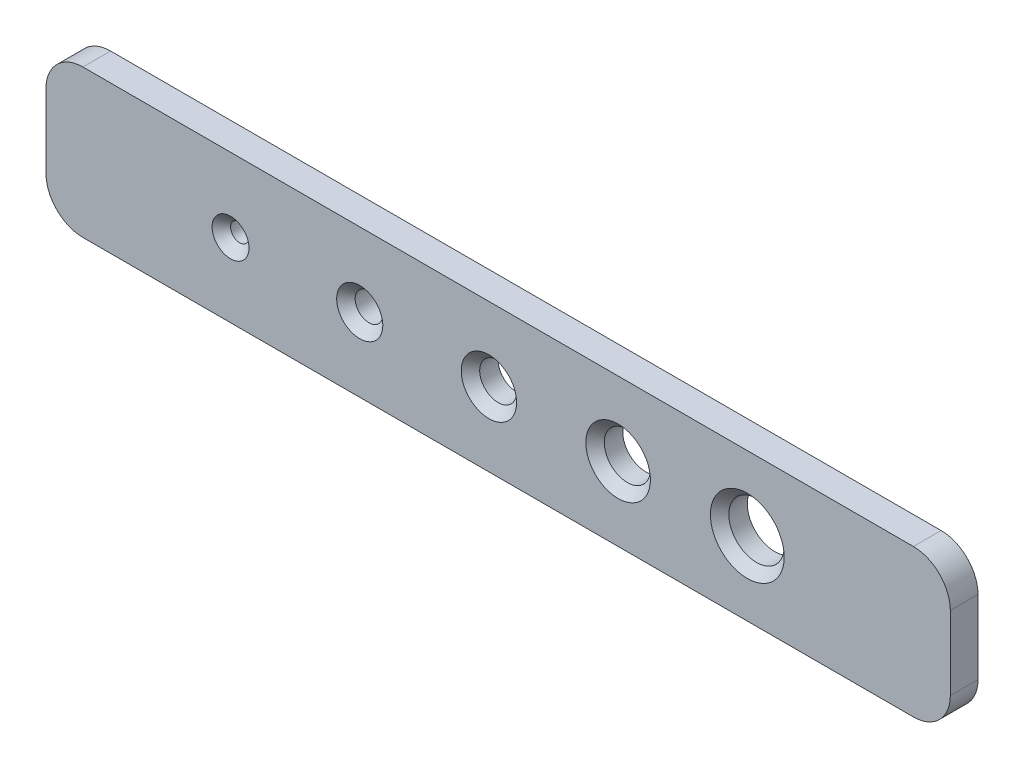
ISO-10303-21;
HEADER;
FILE_DESCRIPTION(('STEP AP214'),'2;1');
FILE_NAME('part.step','',(''),(''),'','','');
FILE_SCHEMA(('AUTOMOTIVE_DESIGN { 1 0 10303 214 1 1 1 1 }'));
ENDSEC;
DATA;
#1=APPLICATION_CONTEXT('core data for automotive mechanical design processes');
#2=APPLICATION_PROTOCOL_DEFINITION('international standard','automotive_design',2000,#1);
#3=PRODUCT_CONTEXT('',#1,'mechanical');
#4=PRODUCT('Part','Part','',(#3));
#5=PRODUCT_RELATED_PRODUCT_CATEGORY('part','',(#4));
#6=PRODUCT_DEFINITION_FORMATION('','',#4);
#7=PRODUCT_DEFINITION_CONTEXT('part definition',#1,'design');
#8=PRODUCT_DEFINITION('design','',#6,#7);
#9=PRODUCT_DEFINITION_SHAPE('','',#8);
#10=(LENGTH_UNIT() NAMED_UNIT(*) SI_UNIT(.MILLI.,.METRE.));
#11=(NAMED_UNIT(*) PLANE_ANGLE_UNIT() SI_UNIT($,.RADIAN.));
#12=(NAMED_UNIT(*) SI_UNIT($,.STERADIAN.) SOLID_ANGLE_UNIT());
#13=UNCERTAINTY_MEASURE_WITH_UNIT(LENGTH_MEASURE(1.E-05),#10,'distance_accuracy_value','');
#14=(GEOMETRIC_REPRESENTATION_CONTEXT(3) GLOBAL_UNCERTAINTY_ASSIGNED_CONTEXT((#13)) GLOBAL_UNIT_ASSIGNED_CONTEXT((#10,
#11,#12)) REPRESENTATION_CONTEXT('',''));
#15=CARTESIAN_POINT('',(0.,0.,0.));
#16=DIRECTION('',(0.,0.,1.));
#17=DIRECTION('',(1.,0.,0.));
#18=AXIS2_PLACEMENT_3D('',#15,#16,#17);
#19=CARTESIAN_POINT('',(0.,0.,4.7625));
#20=DIRECTION('',(1.,0.,0.));
#21=DIRECTION('',(0.,0.,-1.));
#22=AXIS2_PLACEMENT_3D('',#19,#20,#21);
#23=PLANE('',#22);
#24=DIRECTION('',(0.,-1.,0.));
#25=VECTOR('',#24,1.);
#26=CARTESIAN_POINT('',(0.,0.,4.7625));
#27=LINE('',#26,#25);
#28=CARTESIAN_POINT('',(0.,19.05,4.7625));
#29=VERTEX_POINT('',#28);
#30=CARTESIAN_POINT('',(0.,6.35,4.7625));
#31=VERTEX_POINT('',#30);
#32=EDGE_CURVE('E126',#29,#31,#27,.T.);
#33=ORIENTED_EDGE('',*,*,#32,.F.);
#34=DIRECTION('',(0.,0.,-1.));
#35=VECTOR('',#34,1.);
#36=CARTESIAN_POINT('',(0.,19.05,4.7625));
#37=LINE('',#36,#35);
#38=CARTESIAN_POINT('',(0.,19.05,0.));
#39=VERTEX_POINT('',#38);
#40=EDGE_CURVE('E110',#29,#39,#37,.T.);
#41=ORIENTED_EDGE('',*,*,#40,.T.);
#42=DIRECTION('',(0.,-1.,0.));
#43=VECTOR('',#42,1.);
#44=CARTESIAN_POINT('',(0.,0.,0.));
#45=LINE('',#44,#43);
#46=CARTESIAN_POINT('',(0.,6.35,0.));
#47=VERTEX_POINT('',#46);
#48=EDGE_CURVE('E123',#39,#47,#45,.T.);
#49=ORIENTED_EDGE('',*,*,#48,.T.);
#50=DIRECTION('',(0.,0.,-1.));
#51=VECTOR('',#50,1.);
#52=CARTESIAN_POINT('',(0.,6.35,4.7625));
#53=LINE('',#52,#51);
#54=EDGE_CURVE('E129',#47,#31,#53,.F.);
#55=ORIENTED_EDGE('',*,*,#54,.T.);
#56=EDGE_LOOP('',(#33,#41,#49,#55));
#57=FACE_BOUND('',#56,.T.);
#58=ADVANCED_FACE('F39',(#57),#23,.F.);
#59=CARTESIAN_POINT('',(0.,0.,4.7625));
#60=DIRECTION('',(0.,1.,0.));
#61=DIRECTION('',(0.,0.,1.));
#62=AXIS2_PLACEMENT_3D('',#59,#60,#61);
#63=PLANE('',#62);
#64=DIRECTION('',(1.,0.,0.));
#65=VECTOR('',#64,1.);
#66=CARTESIAN_POINT('',(0.,0.,4.7625));
#67=LINE('',#66,#65);
#68=CARTESIAN_POINT('',(6.35,0.,4.7625));
#69=VERTEX_POINT('',#68);
#70=CARTESIAN_POINT('',(149.225,0.,4.7625));
#71=VERTEX_POINT('',#70);
#72=EDGE_CURVE('E191',#69,#71,#67,.T.);
#73=ORIENTED_EDGE('',*,*,#72,.F.);
#74=DIRECTION('',(0.,0.,-1.));
#75=VECTOR('',#74,1.);
#76=CARTESIAN_POINT('',(6.35,0.,4.7625));
#77=LINE('',#76,#75);
#78=CARTESIAN_POINT('',(6.35,0.,0.));
#79=VERTEX_POINT('',#78);
#80=EDGE_CURVE('E182',#69,#79,#77,.T.);
#81=ORIENTED_EDGE('',*,*,#80,.T.);
#82=DIRECTION('',(1.,0.,0.));
#83=VECTOR('',#82,1.);
#84=CARTESIAN_POINT('',(0.,0.,0.));
#85=LINE('',#84,#83);
#86=CARTESIAN_POINT('',(149.225,0.,0.));
#87=VERTEX_POINT('',#86);
#88=EDGE_CURVE('E134',#79,#87,#85,.T.);
#89=ORIENTED_EDGE('',*,*,#88,.T.);
#90=DIRECTION('',(0.,0.,-1.));
#91=VECTOR('',#90,1.);
#92=CARTESIAN_POINT('',(149.225,0.,4.7625));
#93=LINE('',#92,#91);
#94=EDGE_CURVE('E179',#87,#71,#93,.F.);
#95=ORIENTED_EDGE('',*,*,#94,.T.);
#96=EDGE_LOOP('',(#73,#81,#89,#95));
#97=FACE_BOUND('',#96,.T.);
#98=ADVANCED_FACE('F280',(#97),#63,.F.);
#99=CARTESIAN_POINT('',(155.575,0.,4.7625));
#100=DIRECTION('',(-1.,0.,0.));
#101=DIRECTION('',(0.,0.,1.));
#102=AXIS2_PLACEMENT_3D('',#99,#100,#101);
#103=PLANE('',#102);
#104=DIRECTION('',(0.,1.,0.));
#105=VECTOR('',#104,1.);
#106=CARTESIAN_POINT('',(155.575,0.,4.7625));
#107=LINE('',#106,#105);
#108=CARTESIAN_POINT('',(155.575,6.35,4.7625));
#109=VERTEX_POINT('',#108);
#110=CARTESIAN_POINT('',(155.575,19.05,4.7625));
#111=VERTEX_POINT('',#110);
#112=EDGE_CURVE('E189',#109,#111,#107,.T.);
#113=ORIENTED_EDGE('',*,*,#112,.F.);
#114=DIRECTION('',(0.,0.,-1.));
#115=VECTOR('',#114,1.);
#116=CARTESIAN_POINT('',(155.575,6.35,4.7625));
#117=LINE('',#116,#115);
#118=CARTESIAN_POINT('',(155.575,6.35,0.));
#119=VERTEX_POINT('',#118);
#120=EDGE_CURVE('E11',#109,#119,#117,.T.);
#121=ORIENTED_EDGE('',*,*,#120,.T.);
#122=DIRECTION('',(0.,1.,0.));
#123=VECTOR('',#122,1.);
#124=CARTESIAN_POINT('',(155.575,0.,0.));
#125=LINE('',#124,#123);
#126=CARTESIAN_POINT('',(155.575,19.05,0.));
#127=VERTEX_POINT('',#126);
#128=EDGE_CURVE('E140',#119,#127,#125,.T.);
#129=ORIENTED_EDGE('',*,*,#128,.T.);
#130=DIRECTION('',(0.,0.,-1.));
#131=VECTOR('',#130,1.);
#132=CARTESIAN_POINT('',(155.575,19.05,4.7625));
#133=LINE('',#132,#131);
#134=EDGE_CURVE('E48',#127,#111,#133,.F.);
#135=ORIENTED_EDGE('',*,*,#134,.T.);
#136=EDGE_LOOP('',(#113,#121,#129,#135));
#137=FACE_BOUND('',#136,.T.);
#138=ADVANCED_FACE('F273',(#137),#103,.F.);
#139=CARTESIAN_POINT('',(0.,25.4,4.7625));
#140=DIRECTION('',(0.,-1.,0.));
#141=DIRECTION('',(0.,0.,-1.));
#142=AXIS2_PLACEMENT_3D('',#139,#140,#141);
#143=PLANE('',#142);
#144=DIRECTION('',(-1.,0.,0.));
#145=VECTOR('',#144,1.);
#146=CARTESIAN_POINT('',(0.,25.4,0.));
#147=LINE('',#146,#145);
#148=CARTESIAN_POINT('',(149.225,25.4,0.));
#149=VERTEX_POINT('',#148);
#150=CARTESIAN_POINT('',(6.35,25.4,0.));
#151=VERTEX_POINT('',#150);
#152=EDGE_CURVE('E151',#149,#151,#147,.T.);
#153=ORIENTED_EDGE('',*,*,#152,.T.);
#154=DIRECTION('',(0.,0.,-1.));
#155=VECTOR('',#154,1.);
#156=CARTESIAN_POINT('',(6.35,25.4,4.7625));
#157=LINE('',#156,#155);
#158=CARTESIAN_POINT('',(6.35,25.4,4.7625));
#159=VERTEX_POINT('',#158);
#160=EDGE_CURVE('E111',#151,#159,#157,.F.);
#161=ORIENTED_EDGE('',*,*,#160,.T.);
#162=DIRECTION('',(-1.,0.,0.));
#163=VECTOR('',#162,1.);
#164=CARTESIAN_POINT('',(0.,25.4,4.7625));
#165=LINE('',#164,#163);
#166=CARTESIAN_POINT('',(149.225,25.4,4.7625));
#167=VERTEX_POINT('',#166);
#168=EDGE_CURVE('E146',#167,#159,#165,.T.);
#169=ORIENTED_EDGE('',*,*,#168,.F.);
#170=DIRECTION('',(0.,0.,-1.));
#171=VECTOR('',#170,1.);
#172=CARTESIAN_POINT('',(149.225,25.4,4.7625));
#173=LINE('',#172,#171);
#174=EDGE_CURVE('E117',#167,#149,#173,.T.);
#175=ORIENTED_EDGE('',*,*,#174,.T.);
#176=EDGE_LOOP('',(#153,#161,#169,#175));
#177=FACE_BOUND('',#176,.T.);
#178=ADVANCED_FACE('F258',(#177),#143,.F.);
#179=CARTESIAN_POINT('',(0.,0.,4.7625));
#180=DIRECTION('',(0.,0.,-1.));
#181=DIRECTION('',(-1.,0.,0.));
#182=AXIS2_PLACEMENT_3D('',#179,#180,#181);
#183=PLANE('',#182);
#184=CARTESIAN_POINT('',(120.65,12.7,4.7625));
#185=DIRECTION('',(0.,0.,1.));
#186=DIRECTION('',(1.,0.,0.));
#187=AXIS2_PLACEMENT_3D('',#184,#185,#186);
#188=CIRCLE('',#187,6.35000000000001);
#189=CARTESIAN_POINT('',(127.,12.7,4.7625));
#190=VERTEX_POINT('',#189);
#191=EDGE_CURVE('E248',#190,#190,#188,.T.);
#192=ORIENTED_EDGE('',*,*,#191,.F.);
#193=EDGE_LOOP('',(#192));
#194=FACE_BOUND('',#193,.T.);
#195=CARTESIAN_POINT('',(98.425,12.7,4.7625));
#196=DIRECTION('',(0.,0.,1.));
#197=DIRECTION('',(1.,0.,0.));
#198=AXIS2_PLACEMENT_3D('',#195,#196,#197);
#199=CIRCLE('',#198,5.55625);
#200=CARTESIAN_POINT('',(103.98125,12.7,4.7625));
#201=VERTEX_POINT('',#200);
#202=EDGE_CURVE('E240',#201,#201,#199,.T.);
#203=ORIENTED_EDGE('',*,*,#202,.F.);
#204=EDGE_LOOP('',(#203));
#205=FACE_BOUND('',#204,.T.);
#206=CARTESIAN_POINT('',(76.2,12.7,4.7625));
#207=DIRECTION('',(0.,0.,1.));
#208=DIRECTION('',(1.,0.,0.));
#209=AXIS2_PLACEMENT_3D('',#206,#207,#208);
#210=CIRCLE('',#209,4.7625);
#211=CARTESIAN_POINT('',(80.9625,12.7,4.7625));
#212=VERTEX_POINT('',#211);
#213=EDGE_CURVE('E232',#212,#212,#210,.T.);
#214=ORIENTED_EDGE('',*,*,#213,.F.);
#215=EDGE_LOOP('',(#214));
#216=FACE_BOUND('',#215,.T.);
#217=CARTESIAN_POINT('',(53.975,12.7,4.7625));
#218=DIRECTION('',(0.,0.,1.));
#219=DIRECTION('',(1.,0.,0.));
#220=AXIS2_PLACEMENT_3D('',#217,#218,#219);
#221=CIRCLE('',#220,3.96875);
#222=CARTESIAN_POINT('',(57.94375,12.7,4.7625));
#223=VERTEX_POINT('',#222);
#224=EDGE_CURVE('E224',#223,#223,#221,.T.);
#225=ORIENTED_EDGE('',*,*,#224,.F.);
#226=EDGE_LOOP('',(#225));
#227=FACE_BOUND('',#226,.T.);
#228=CARTESIAN_POINT('',(31.75,12.7,4.7625));
#229=DIRECTION('',(0.,0.,1.));
#230=DIRECTION('',(1.,0.,0.));
#231=AXIS2_PLACEMENT_3D('',#228,#229,#230);
#232=CIRCLE('',#231,3.175);
#233=CARTESIAN_POINT('',(34.925,12.7,4.7625));
#234=VERTEX_POINT('',#233);
#235=EDGE_CURVE('E216',#234,#234,#232,.T.);
#236=ORIENTED_EDGE('',*,*,#235,.F.);
#237=EDGE_LOOP('',(#236));
#238=FACE_BOUND('',#237,.T.);
#239=ORIENTED_EDGE('',*,*,#168,.T.);
#240=CARTESIAN_POINT('',(6.35,19.05,4.7625));
#241=DIRECTION('',(0.,0.,-1.));
#242=DIRECTION('',(-1.,0.,0.));
#243=AXIS2_PLACEMENT_3D('',#240,#241,#242);
#244=CIRCLE('',#243,6.35);
#245=EDGE_CURVE('E176',#159,#29,#244,.F.);
#246=ORIENTED_EDGE('',*,*,#245,.T.);
#247=ORIENTED_EDGE('',*,*,#32,.T.);
#248=CARTESIAN_POINT('',(6.35,6.35,4.7625));
#249=DIRECTION('',(0.,0.,-1.));
#250=DIRECTION('',(-1.,0.,0.));
#251=AXIS2_PLACEMENT_3D('',#248,#249,#250);
#252=CIRCLE('',#251,6.35);
#253=EDGE_CURVE('E173',#31,#69,#252,.F.);
#254=ORIENTED_EDGE('',*,*,#253,.T.);
#255=ORIENTED_EDGE('',*,*,#72,.T.);
#256=CARTESIAN_POINT('',(149.225,6.35,4.7625));
#257=DIRECTION('',(0.,0.,-1.));
#258=DIRECTION('',(-1.,0.,0.));
#259=AXIS2_PLACEMENT_3D('',#256,#257,#258);
#260=CIRCLE('',#259,6.35);
#261=EDGE_CURVE('E61',#71,#109,#260,.F.);
#262=ORIENTED_EDGE('',*,*,#261,.T.);
#263=ORIENTED_EDGE('',*,*,#112,.T.);
#264=CARTESIAN_POINT('',(149.225,19.05,4.7625));
#265=DIRECTION('',(0.,0.,-1.));
#266=DIRECTION('',(-1.,0.,0.));
#267=AXIS2_PLACEMENT_3D('',#264,#265,#266);
#268=CIRCLE('',#267,6.35);
#269=EDGE_CURVE('E168',#111,#167,#268,.F.);
#270=ORIENTED_EDGE('',*,*,#269,.T.);
#271=EDGE_LOOP('',(#239,#246,#247,#254,#255,#262,#263,#270));
#272=FACE_BOUND('',#271,.T.);
#273=ADVANCED_FACE('F255',(#194,#205,#216,#227,#238,#272),#183,.F.);
#274=CARTESIAN_POINT('',(0.,0.,0.));
#275=DIRECTION('',(0.,0.,-1.));
#276=DIRECTION('',(-1.,0.,0.));
#277=AXIS2_PLACEMENT_3D('',#274,#275,#276);
#278=PLANE('',#277);
#279=CARTESIAN_POINT('',(120.65,12.7,0.));
#280=DIRECTION('',(0.,0.,1.));
#281=DIRECTION('',(1.,0.,0.));
#282=AXIS2_PLACEMENT_3D('',#279,#280,#281);
#283=CIRCLE('',#282,4.7625);
#284=CARTESIAN_POINT('',(125.4125,12.7,0.));
#285=VERTEX_POINT('',#284);
#286=EDGE_CURVE('E135',#285,#285,#283,.T.);
#287=ORIENTED_EDGE('',*,*,#286,.T.);
#288=EDGE_LOOP('',(#287));
#289=FACE_BOUND('',#288,.T.);
#290=CARTESIAN_POINT('',(98.425,12.7,0.));
#291=DIRECTION('',(0.,0.,1.));
#292=DIRECTION('',(1.,0.,0.));
#293=AXIS2_PLACEMENT_3D('',#290,#291,#292);
#294=CIRCLE('',#293,3.96875);
#295=CARTESIAN_POINT('',(102.39375,12.7,0.));
#296=VERTEX_POINT('',#295);
#297=EDGE_CURVE('E143',#296,#296,#294,.T.);
#298=ORIENTED_EDGE('',*,*,#297,.T.);
#299=EDGE_LOOP('',(#298));
#300=FACE_BOUND('',#299,.T.);
#301=CARTESIAN_POINT('',(76.2,12.7,0.));
#302=DIRECTION('',(0.,0.,1.));
#303=DIRECTION('',(1.,0.,0.));
#304=AXIS2_PLACEMENT_3D('',#301,#302,#303);
#305=CIRCLE('',#304,3.175);
#306=CARTESIAN_POINT('',(79.375,12.7,0.));
#307=VERTEX_POINT('',#306);
#308=EDGE_CURVE('E206',#307,#307,#305,.T.);
#309=ORIENTED_EDGE('',*,*,#308,.T.);
#310=EDGE_LOOP('',(#309));
#311=FACE_BOUND('',#310,.T.);
#312=CARTESIAN_POINT('',(53.975,12.7,0.));
#313=DIRECTION('',(0.,0.,1.));
#314=DIRECTION('',(1.,0.,0.));
#315=AXIS2_PLACEMENT_3D('',#312,#313,#314);
#316=CIRCLE('',#315,2.38125);
#317=CARTESIAN_POINT('',(56.35625,12.7,0.));
#318=VERTEX_POINT('',#317);
#319=EDGE_CURVE('E201',#318,#318,#316,.T.);
#320=ORIENTED_EDGE('',*,*,#319,.T.);
#321=EDGE_LOOP('',(#320));
#322=FACE_BOUND('',#321,.T.);
#323=CARTESIAN_POINT('',(31.75,12.7,0.));
#324=DIRECTION('',(0.,0.,1.));
#325=DIRECTION('',(1.,0.,0.));
#326=AXIS2_PLACEMENT_3D('',#323,#324,#325);
#327=CIRCLE('',#326,1.5875);
#328=CARTESIAN_POINT('',(33.3375,12.7,0.));
#329=VERTEX_POINT('',#328);
#330=EDGE_CURVE('E197',#329,#329,#327,.T.);
#331=ORIENTED_EDGE('',*,*,#330,.T.);
#332=EDGE_LOOP('',(#331));
#333=FACE_BOUND('',#332,.T.);
#334=ORIENTED_EDGE('',*,*,#48,.F.);
#335=CARTESIAN_POINT('',(6.35,19.05,0.));
#336=DIRECTION('',(0.,0.,-1.));
#337=DIRECTION('',(-1.,0.,0.));
#338=AXIS2_PLACEMENT_3D('',#335,#336,#337);
#339=CIRCLE('',#338,6.35);
#340=EDGE_CURVE('E106',#39,#151,#339,.T.);
#341=ORIENTED_EDGE('',*,*,#340,.T.);
#342=ORIENTED_EDGE('',*,*,#152,.F.);
#343=CARTESIAN_POINT('',(149.225,19.05,0.));
#344=DIRECTION('',(0.,0.,-1.));
#345=DIRECTION('',(-1.,0.,0.));
#346=AXIS2_PLACEMENT_3D('',#343,#344,#345);
#347=CIRCLE('',#346,6.35);
#348=EDGE_CURVE('E128',#149,#127,#347,.T.);
#349=ORIENTED_EDGE('',*,*,#348,.T.);
#350=ORIENTED_EDGE('',*,*,#128,.F.);
#351=CARTESIAN_POINT('',(149.225,6.35,0.));
#352=DIRECTION('',(0.,0.,-1.));
#353=DIRECTION('',(-1.,0.,0.));
#354=AXIS2_PLACEMENT_3D('',#351,#352,#353);
#355=CIRCLE('',#354,6.35);
#356=EDGE_CURVE('E158',#119,#87,#355,.T.);
#357=ORIENTED_EDGE('',*,*,#356,.T.);
#358=ORIENTED_EDGE('',*,*,#88,.F.);
#359=CARTESIAN_POINT('',(6.35,6.35,0.));
#360=DIRECTION('',(0.,0.,-1.));
#361=DIRECTION('',(-1.,0.,0.));
#362=AXIS2_PLACEMENT_3D('',#359,#360,#361);
#363=CIRCLE('',#362,6.35);
#364=EDGE_CURVE('E118',#79,#47,#363,.T.);
#365=ORIENTED_EDGE('',*,*,#364,.T.);
#366=EDGE_LOOP('',(#334,#341,#342,#349,#350,#357,#358,#365));
#367=FACE_BOUND('',#366,.T.);
#368=ADVANCED_FACE('F131',(#289,#300,#311,#322,#333,#367),#278,.T.);
#369=CARTESIAN_POINT('',(6.35,19.05,4.7625));
#370=DIRECTION('',(0.,0.,-1.));
#371=DIRECTION('',(-1.,0.,0.));
#372=AXIS2_PLACEMENT_3D('',#369,#370,#371);
#373=CYLINDRICAL_SURFACE('',#372,6.35);
#374=ORIENTED_EDGE('',*,*,#245,.F.);
#375=ORIENTED_EDGE('',*,*,#160,.F.);
#376=ORIENTED_EDGE('',*,*,#340,.F.);
#377=ORIENTED_EDGE('',*,*,#40,.F.);
#378=EDGE_LOOP('',(#374,#375,#376,#377));
#379=FACE_BOUND('',#378,.T.);
#380=ADVANCED_FACE('F109',(#379),#373,.T.);
#381=CARTESIAN_POINT('',(6.35,6.35,4.7625));
#382=DIRECTION('',(0.,0.,-1.));
#383=DIRECTION('',(-1.,0.,0.));
#384=AXIS2_PLACEMENT_3D('',#381,#382,#383);
#385=CYLINDRICAL_SURFACE('',#384,6.35);
#386=ORIENTED_EDGE('',*,*,#253,.F.);
#387=ORIENTED_EDGE('',*,*,#54,.F.);
#388=ORIENTED_EDGE('',*,*,#364,.F.);
#389=ORIENTED_EDGE('',*,*,#80,.F.);
#390=EDGE_LOOP('',(#386,#387,#388,#389));
#391=FACE_BOUND('',#390,.T.);
#392=ADVANCED_FACE('F283',(#391),#385,.T.);
#393=CARTESIAN_POINT('',(149.225,6.35,4.7625));
#394=DIRECTION('',(0.,0.,-1.));
#395=DIRECTION('',(-1.,0.,0.));
#396=AXIS2_PLACEMENT_3D('',#393,#394,#395);
#397=CYLINDRICAL_SURFACE('',#396,6.35);
#398=ORIENTED_EDGE('',*,*,#261,.F.);
#399=ORIENTED_EDGE('',*,*,#94,.F.);
#400=ORIENTED_EDGE('',*,*,#356,.F.);
#401=ORIENTED_EDGE('',*,*,#120,.F.);
#402=EDGE_LOOP('',(#398,#399,#400,#401));
#403=FACE_BOUND('',#402,.T.);
#404=ADVANCED_FACE('F276',(#403),#397,.T.);
#405=CARTESIAN_POINT('',(149.225,19.05,4.7625));
#406=DIRECTION('',(0.,0.,-1.));
#407=DIRECTION('',(-1.,0.,0.));
#408=AXIS2_PLACEMENT_3D('',#405,#406,#407);
#409=CYLINDRICAL_SURFACE('',#408,6.35);
#410=ORIENTED_EDGE('',*,*,#269,.F.);
#411=ORIENTED_EDGE('',*,*,#134,.F.);
#412=ORIENTED_EDGE('',*,*,#348,.F.);
#413=ORIENTED_EDGE('',*,*,#174,.F.);
#414=EDGE_LOOP('',(#410,#411,#412,#413));
#415=FACE_BOUND('',#414,.T.);
#416=ADVANCED_FACE('F41',(#415),#409,.T.);
#417=CARTESIAN_POINT('',(31.75,12.7,0.));
#418=DIRECTION('',(0.,0.,1.));
#419=DIRECTION('',(1.,0.,0.));
#420=AXIS2_PLACEMENT_3D('',#417,#418,#419);
#421=CYLINDRICAL_SURFACE('',#420,1.5875);
#422=CARTESIAN_POINT('',(31.75,12.7,3.175));
#423=DIRECTION('',(0.,0.,1.));
#424=DIRECTION('',(1.,0.,0.));
#425=AXIS2_PLACEMENT_3D('',#422,#423,#424);
#426=CIRCLE('',#425,1.5875);
#427=CARTESIAN_POINT('',(33.3375,12.7,3.175));
#428=VERTEX_POINT('',#427);
#429=EDGE_CURVE('E202',#428,#428,#426,.T.);
#430=CARTESIAN_POINT('',(33.3375,12.7,3.175));
#431=CARTESIAN_POINT('',(33.3375,12.7,3.14192708333333));
#432=CARTESIAN_POINT('',(33.3375,12.7,3.10885416666666));
#433=CARTESIAN_POINT('',(33.3375,12.7,3.04270833333333));
#434=CARTESIAN_POINT('',(33.3375,12.7,3.00963541666666));
#435=CARTESIAN_POINT('',(33.3375,12.7,2.94348958333333));
#436=CARTESIAN_POINT('',(33.3375,12.7,2.91041666666666));
#437=CARTESIAN_POINT('',(33.3375,12.7,2.84427083333333));
#438=CARTESIAN_POINT('',(33.3375,12.7,2.81119791666666));
#439=CARTESIAN_POINT('',(33.3375,12.7,2.74505208333333));
#440=CARTESIAN_POINT('',(33.3375,12.7,2.71197916666666));
#441=CARTESIAN_POINT('',(33.3375,12.7,2.64583333333333));
#442=CARTESIAN_POINT('',(33.3375,12.7,2.61276041666666));
#443=CARTESIAN_POINT('',(33.3375,12.7,2.54661458333333));
#444=CARTESIAN_POINT('',(33.3375,12.7,2.51354166666667));
#445=CARTESIAN_POINT('',(33.3375,12.7,2.44739583333333));
#446=CARTESIAN_POINT('',(33.3375,12.7,2.41432291666667));
#447=CARTESIAN_POINT('',(33.3375,12.7,2.34817708333333));
#448=CARTESIAN_POINT('',(33.3375,12.7,2.31510416666667));
#449=CARTESIAN_POINT('',(33.3375,12.7,2.24895833333333));
#450=CARTESIAN_POINT('',(33.3375,12.7,2.21588541666666));
#451=CARTESIAN_POINT('',(33.3375,12.7,2.14973958333333));
#452=CARTESIAN_POINT('',(33.3375,12.7,2.11666666666666));
#453=CARTESIAN_POINT('',(33.3375,12.7,2.05052083333333));
#454=CARTESIAN_POINT('',(33.3375,12.7,2.01744791666667));
#455=CARTESIAN_POINT('',(33.3375,12.7,1.95130208333333));
#456=CARTESIAN_POINT('',(33.3375,12.7,1.91822916666667));
#457=CARTESIAN_POINT('',(33.3375,12.7,1.85208333333333));
#458=CARTESIAN_POINT('',(33.3375,12.7,1.81901041666667));
#459=CARTESIAN_POINT('',(33.3375,12.7,1.75286458333333));
#460=CARTESIAN_POINT('',(33.3375,12.7,1.71979166666667));
#461=CARTESIAN_POINT('',(33.3375,12.7,1.65364583333333));
#462=CARTESIAN_POINT('',(33.3375,12.7,1.62057291666667));
#463=CARTESIAN_POINT('',(33.3375,12.7,1.55442708333333));
#464=CARTESIAN_POINT('',(33.3375,12.7,1.52135416666667));
#465=CARTESIAN_POINT('',(33.3375,12.7,1.45520833333333));
#466=CARTESIAN_POINT('',(33.3375,12.7,1.42213541666667));
#467=CARTESIAN_POINT('',(33.3375,12.7,1.35598958333333));
#468=CARTESIAN_POINT('',(33.3375,12.7,1.32291666666667));
#469=CARTESIAN_POINT('',(33.3375,12.7,1.25677083333333));
#470=CARTESIAN_POINT('',(33.3375,12.7,1.22369791666667));
#471=CARTESIAN_POINT('',(33.3375,12.7,1.15755208333333));
#472=CARTESIAN_POINT('',(33.3375,12.7,1.12447916666667));
#473=CARTESIAN_POINT('',(33.3375,12.7,1.05833333333333));
#474=CARTESIAN_POINT('',(33.3375,12.7,1.02526041666667));
#475=CARTESIAN_POINT('',(33.3375,12.7,0.959114583333333));
#476=CARTESIAN_POINT('',(33.3375,12.7,0.926041666666666));
#477=CARTESIAN_POINT('',(33.3375,12.7,0.859895833333333));
#478=CARTESIAN_POINT('',(33.3375,12.7,0.826822916666666));
#479=CARTESIAN_POINT('',(33.3375,12.7,0.760677083333333));
#480=CARTESIAN_POINT('',(33.3375,12.7,0.727604166666666));
#481=CARTESIAN_POINT('',(33.3375,12.7,0.661458333333333));
#482=CARTESIAN_POINT('',(33.3375,12.7,0.628385416666666));
#483=CARTESIAN_POINT('',(33.3375,12.7,0.562239583333333));
#484=CARTESIAN_POINT('',(33.3375,12.7,0.529166666666666));
#485=CARTESIAN_POINT('',(33.3375,12.7,0.463020833333333));
#486=CARTESIAN_POINT('',(33.3375,12.7,0.429947916666666));
#487=CARTESIAN_POINT('',(33.3375,12.7,0.363802083333333));
#488=CARTESIAN_POINT('',(33.3375,12.7,0.330729166666666));
#489=CARTESIAN_POINT('',(33.3375,12.7,0.264583333333333));
#490=CARTESIAN_POINT('',(33.3375,12.7,0.231510416666666));
#491=CARTESIAN_POINT('',(33.3375,12.7,0.165364583333333));
#492=CARTESIAN_POINT('',(33.3375,12.7,0.132291666666667));
#493=CARTESIAN_POINT('',(33.3375,12.7,0.0661458333333333));
#494=CARTESIAN_POINT('',(33.3375,12.7,0.0330729166666666));
#495=CARTESIAN_POINT('',(33.3375,12.7,0.));
#496=B_SPLINE_CURVE_WITH_KNOTS('',3,(#430,#431,#432,#433,#434,#435,#436,#437,#438,#439,#440,
#441,#442,#443,#444,#445,#446,#447,#448,#449,#450,#451,#452,#453,#454,#455,#456,#457,#458,#459,
#460,#461,#462,#463,#464,#465,#466,#467,#468,#469,#470,#471,#472,#473,#474,#475,#476,#477,#478,
#479,#480,#481,#482,#483,#484,#485,#486,#487,#488,#489,#490,#491,#492,#493,#494,#495),
.UNSPECIFIED.,.F.,.F.,(4,2,2,2,2,2,2,2,2,2,2,2,2,2,2,2,2,2,2,2,2,2,2,2,2,2,2,2,2,2,2,2,4),(0.,
0.0992187499999999,0.1984375,0.29765625,0.396875,0.49609375,0.595312499999999,0.69453125,
0.793749999999999,0.89296875,0.992187499999999,1.09140625,1.190625,1.28984375,1.3890625,
1.48828125,1.5875,1.68671875,1.7859375,1.88515625,1.984375,2.08359375,2.1828125,2.28203125,
2.38125,2.48046875,2.5796875,2.67890625,2.778125,2.87734375,2.9765625,3.07578125,3.175),.UNSPECIFIED.);
#497=EDGE_CURVE('BSEAM305',#428,#329,#496,.T.);
#498=ORIENTED_EDGE('',*,*,#429,.T.);
#499=ORIENTED_EDGE('',*,*,#330,.F.);
#500=ORIENTED_EDGE('',*,*,#497,.T.);
#501=ORIENTED_EDGE('',*,*,#497,.F.);
#502=EDGE_LOOP('',(#498,#500,#499,#501));
#503=FACE_BOUND('',#502,.T.);
#504=ADVANCED_FACE('F305',(#503),#421,.F.);
#505=CARTESIAN_POINT('',(53.975,12.7,0.));
#506=DIRECTION('',(0.,0.,1.));
#507=DIRECTION('',(1.,0.,0.));
#508=AXIS2_PLACEMENT_3D('',#505,#506,#507);
#509=CYLINDRICAL_SURFACE('',#508,2.38125);
#510=CARTESIAN_POINT('',(53.975,12.7,3.175));
#511=DIRECTION('',(0.,0.,1.));
#512=DIRECTION('',(1.,0.,0.));
#513=AXIS2_PLACEMENT_3D('',#510,#511,#512);
#514=CIRCLE('',#513,2.38125);
#515=CARTESIAN_POINT('',(56.35625,12.7,3.175));
#516=VERTEX_POINT('',#515);
#517=EDGE_CURVE('E220',#516,#516,#514,.T.);
#518=CARTESIAN_POINT('',(56.35625,12.7,3.175));
#519=CARTESIAN_POINT('',(56.35625,12.7,3.14192708333333));
#520=CARTESIAN_POINT('',(56.35625,12.7,3.10885416666667));
#521=CARTESIAN_POINT('',(56.35625,12.7,3.04270833333333));
#522=CARTESIAN_POINT('',(56.35625,12.7,3.00963541666667));
#523=CARTESIAN_POINT('',(56.35625,12.7,2.94348958333333));
#524=CARTESIAN_POINT('',(56.35625,12.7,2.91041666666667));
#525=CARTESIAN_POINT('',(56.35625,12.7,2.84427083333333));
#526=CARTESIAN_POINT('',(56.35625,12.7,2.81119791666667));
#527=CARTESIAN_POINT('',(56.35625,12.7,2.74505208333333));
#528=CARTESIAN_POINT('',(56.35625,12.7,2.71197916666667));
#529=CARTESIAN_POINT('',(56.35625,12.7,2.64583333333333));
#530=CARTESIAN_POINT('',(56.35625,12.7,2.61276041666667));
#531=CARTESIAN_POINT('',(56.35625,12.7,2.54661458333333));
#532=CARTESIAN_POINT('',(56.35625,12.7,2.51354166666667));
#533=CARTESIAN_POINT('',(56.35625,12.7,2.44739583333333));
#534=CARTESIAN_POINT('',(56.35625,12.7,2.41432291666667));
#535=CARTESIAN_POINT('',(56.35625,12.7,2.34817708333333));
#536=CARTESIAN_POINT('',(56.35625,12.7,2.31510416666667));
#537=CARTESIAN_POINT('',(56.35625,12.7,2.24895833333333));
#538=CARTESIAN_POINT('',(56.35625,12.7,2.21588541666667));
#539=CARTESIAN_POINT('',(56.35625,12.7,2.14973958333333));
#540=CARTESIAN_POINT('',(56.35625,12.7,2.11666666666667));
#541=CARTESIAN_POINT('',(56.35625,12.7,2.05052083333333));
#542=CARTESIAN_POINT('',(56.35625,12.7,2.01744791666667));
#543=CARTESIAN_POINT('',(56.35625,12.7,1.95130208333333));
#544=CARTESIAN_POINT('',(56.35625,12.7,1.91822916666667));
#545=CARTESIAN_POINT('',(56.35625,12.7,1.85208333333333));
#546=CARTESIAN_POINT('',(56.35625,12.7,1.81901041666667));
#547=CARTESIAN_POINT('',(56.35625,12.7,1.75286458333333));
#548=CARTESIAN_POINT('',(56.35625,12.7,1.71979166666667));
#549=CARTESIAN_POINT('',(56.35625,12.7,1.65364583333333));
#550=CARTESIAN_POINT('',(56.35625,12.7,1.62057291666667));
#551=CARTESIAN_POINT('',(56.35625,12.7,1.55442708333333));
#552=CARTESIAN_POINT('',(56.35625,12.7,1.52135416666667));
#553=CARTESIAN_POINT('',(56.35625,12.7,1.45520833333333));
#554=CARTESIAN_POINT('',(56.35625,12.7,1.42213541666667));
#555=CARTESIAN_POINT('',(56.35625,12.7,1.35598958333333));
#556=CARTESIAN_POINT('',(56.35625,12.7,1.32291666666667));
#557=CARTESIAN_POINT('',(56.35625,12.7,1.25677083333333));
#558=CARTESIAN_POINT('',(56.35625,12.7,1.22369791666667));
#559=CARTESIAN_POINT('',(56.35625,12.7,1.15755208333333));
#560=CARTESIAN_POINT('',(56.35625,12.7,1.12447916666667));
#561=CARTESIAN_POINT('',(56.35625,12.7,1.05833333333333));
#562=CARTESIAN_POINT('',(56.35625,12.7,1.02526041666667));
#563=CARTESIAN_POINT('',(56.35625,12.7,0.959114583333333));
#564=CARTESIAN_POINT('',(56.35625,12.7,0.926041666666667));
#565=CARTESIAN_POINT('',(56.35625,12.7,0.859895833333333));
#566=CARTESIAN_POINT('',(56.35625,12.7,0.826822916666667));
#567=CARTESIAN_POINT('',(56.35625,12.7,0.760677083333334));
#568=CARTESIAN_POINT('',(56.35625,12.7,0.727604166666667));
#569=CARTESIAN_POINT('',(56.35625,12.7,0.661458333333334));
#570=CARTESIAN_POINT('',(56.35625,12.7,0.628385416666667));
#571=CARTESIAN_POINT('',(56.35625,12.7,0.562239583333333));
#572=CARTESIAN_POINT('',(56.35625,12.7,0.529166666666667));
#573=CARTESIAN_POINT('',(56.35625,12.7,0.463020833333333));
#574=CARTESIAN_POINT('',(56.35625,12.7,0.429947916666667));
#575=CARTESIAN_POINT('',(56.35625,12.7,0.363802083333333));
#576=CARTESIAN_POINT('',(56.35625,12.7,0.330729166666667));
#577=CARTESIAN_POINT('',(56.35625,12.7,0.264583333333333));
#578=CARTESIAN_POINT('',(56.35625,12.7,0.231510416666667));
#579=CARTESIAN_POINT('',(56.35625,12.7,0.165364583333333));
#580=CARTESIAN_POINT('',(56.35625,12.7,0.132291666666667));
#581=CARTESIAN_POINT('',(56.35625,12.7,0.0661458333333333));
#582=CARTESIAN_POINT('',(56.35625,12.7,0.0330729166666666));
#583=CARTESIAN_POINT('',(56.35625,12.7,0.));
#584=B_SPLINE_CURVE_WITH_KNOTS('',3,(#518,#519,#520,#521,#522,#523,#524,#525,#526,#527,#528,
#529,#530,#531,#532,#533,#534,#535,#536,#537,#538,#539,#540,#541,#542,#543,#544,#545,#546,#547,
#548,#549,#550,#551,#552,#553,#554,#555,#556,#557,#558,#559,#560,#561,#562,#563,#564,#565,#566,
#567,#568,#569,#570,#571,#572,#573,#574,#575,#576,#577,#578,#579,#580,#581,#582,#583),
.UNSPECIFIED.,.F.,.F.,(4,2,2,2,2,2,2,2,2,2,2,2,2,2,2,2,2,2,2,2,2,2,2,2,2,2,2,2,2,2,2,2,4),(0.,
0.0992187499999999,0.1984375,0.29765625,0.396875,0.49609375,0.5953125,0.69453125,0.79375,
0.89296875,0.9921875,1.09140625,1.190625,1.28984375,1.3890625,1.48828125,1.5875,1.68671875,
1.7859375,1.88515625,1.984375,2.08359375,2.1828125,2.28203125,2.38125,2.48046875,2.5796875,
2.67890625,2.778125,2.87734375,2.9765625,3.07578125,3.175),.UNSPECIFIED.);
#585=EDGE_CURVE('BSEAM308',#516,#318,#584,.T.);
#586=ORIENTED_EDGE('',*,*,#517,.T.);
#587=ORIENTED_EDGE('',*,*,#319,.F.);
#588=ORIENTED_EDGE('',*,*,#585,.T.);
#589=ORIENTED_EDGE('',*,*,#585,.F.);
#590=EDGE_LOOP('',(#586,#588,#587,#589));
#591=FACE_BOUND('',#590,.T.);
#592=ADVANCED_FACE('F308',(#591),#509,.F.);
#593=CARTESIAN_POINT('',(76.2,12.7,0.));
#594=DIRECTION('',(0.,0.,1.));
#595=DIRECTION('',(1.,0.,0.));
#596=AXIS2_PLACEMENT_3D('',#593,#594,#595);
#597=CYLINDRICAL_SURFACE('',#596,3.175);
#598=CARTESIAN_POINT('',(76.2,12.7,3.175));
#599=DIRECTION('',(0.,0.,1.));
#600=DIRECTION('',(1.,0.,0.));
#601=AXIS2_PLACEMENT_3D('',#598,#599,#600);
#602=CIRCLE('',#601,3.175);
#603=CARTESIAN_POINT('',(79.375,12.7,3.175));
#604=VERTEX_POINT('',#603);
#605=EDGE_CURVE('E228',#604,#604,#602,.T.);
#606=CARTESIAN_POINT('',(79.375,12.7,3.175));
#607=CARTESIAN_POINT('',(79.375,12.7,3.14192708333333));
#608=CARTESIAN_POINT('',(79.375,12.7,3.10885416666667));
#609=CARTESIAN_POINT('',(79.375,12.7,3.04270833333333));
#610=CARTESIAN_POINT('',(79.375,12.7,3.00963541666667));
#611=CARTESIAN_POINT('',(79.375,12.7,2.94348958333333));
#612=CARTESIAN_POINT('',(79.375,12.7,2.91041666666667));
#613=CARTESIAN_POINT('',(79.375,12.7,2.84427083333333));
#614=CARTESIAN_POINT('',(79.375,12.7,2.81119791666667));
#615=CARTESIAN_POINT('',(79.375,12.7,2.74505208333333));
#616=CARTESIAN_POINT('',(79.375,12.7,2.71197916666667));
#617=CARTESIAN_POINT('',(79.375,12.7,2.64583333333333));
#618=CARTESIAN_POINT('',(79.375,12.7,2.61276041666667));
#619=CARTESIAN_POINT('',(79.375,12.7,2.54661458333333));
#620=CARTESIAN_POINT('',(79.375,12.7,2.51354166666667));
#621=CARTESIAN_POINT('',(79.375,12.7,2.44739583333333));
#622=CARTESIAN_POINT('',(79.375,12.7,2.41432291666667));
#623=CARTESIAN_POINT('',(79.375,12.7,2.34817708333333));
#624=CARTESIAN_POINT('',(79.375,12.7,2.31510416666667));
#625=CARTESIAN_POINT('',(79.375,12.7,2.24895833333333));
#626=CARTESIAN_POINT('',(79.375,12.7,2.21588541666667));
#627=CARTESIAN_POINT('',(79.375,12.7,2.14973958333333));
#628=CARTESIAN_POINT('',(79.375,12.7,2.11666666666667));
#629=CARTESIAN_POINT('',(79.375,12.7,2.05052083333333));
#630=CARTESIAN_POINT('',(79.375,12.7,2.01744791666667));
#631=CARTESIAN_POINT('',(79.375,12.7,1.95130208333333));
#632=CARTESIAN_POINT('',(79.375,12.7,1.91822916666667));
#633=CARTESIAN_POINT('',(79.375,12.7,1.85208333333333));
#634=CARTESIAN_POINT('',(79.375,12.7,1.81901041666667));
#635=CARTESIAN_POINT('',(79.375,12.7,1.75286458333333));
#636=CARTESIAN_POINT('',(79.375,12.7,1.71979166666667));
#637=CARTESIAN_POINT('',(79.375,12.7,1.65364583333333));
#638=CARTESIAN_POINT('',(79.375,12.7,1.62057291666667));
#639=CARTESIAN_POINT('',(79.375,12.7,1.55442708333333));
#640=CARTESIAN_POINT('',(79.375,12.7,1.52135416666667));
#641=CARTESIAN_POINT('',(79.375,12.7,1.45520833333333));
#642=CARTESIAN_POINT('',(79.375,12.7,1.42213541666667));
#643=CARTESIAN_POINT('',(79.375,12.7,1.35598958333333));
#644=CARTESIAN_POINT('',(79.375,12.7,1.32291666666667));
#645=CARTESIAN_POINT('',(79.375,12.7,1.25677083333333));
#646=CARTESIAN_POINT('',(79.375,12.7,1.22369791666667));
#647=CARTESIAN_POINT('',(79.375,12.7,1.15755208333333));
#648=CARTESIAN_POINT('',(79.375,12.7,1.12447916666667));
#649=CARTESIAN_POINT('',(79.375,12.7,1.05833333333333));
#650=CARTESIAN_POINT('',(79.375,12.7,1.02526041666667));
#651=CARTESIAN_POINT('',(79.375,12.7,0.959114583333333));
#652=CARTESIAN_POINT('',(79.375,12.7,0.926041666666666));
#653=CARTESIAN_POINT('',(79.375,12.7,0.859895833333333));
#654=CARTESIAN_POINT('',(79.375,12.7,0.826822916666666));
#655=CARTESIAN_POINT('',(79.375,12.7,0.760677083333333));
#656=CARTESIAN_POINT('',(79.375,12.7,0.727604166666666));
#657=CARTESIAN_POINT('',(79.375,12.7,0.661458333333333));
#658=CARTESIAN_POINT('',(79.375,12.7,0.628385416666666));
#659=CARTESIAN_POINT('',(79.375,12.7,0.562239583333333));
#660=CARTESIAN_POINT('',(79.375,12.7,0.529166666666666));
#661=CARTESIAN_POINT('',(79.375,12.7,0.463020833333333));
#662=CARTESIAN_POINT('',(79.375,12.7,0.429947916666666));
#663=CARTESIAN_POINT('',(79.375,12.7,0.363802083333333));
#664=CARTESIAN_POINT('',(79.375,12.7,0.330729166666666));
#665=CARTESIAN_POINT('',(79.375,12.7,0.264583333333333));
#666=CARTESIAN_POINT('',(79.375,12.7,0.231510416666666));
#667=CARTESIAN_POINT('',(79.375,12.7,0.165364583333333));
#668=CARTESIAN_POINT('',(79.375,12.7,0.132291666666667));
#669=CARTESIAN_POINT('',(79.375,12.7,0.0661458333333333));
#670=CARTESIAN_POINT('',(79.375,12.7,0.0330729166666666));
#671=CARTESIAN_POINT('',(79.375,12.7,0.));
#672=B_SPLINE_CURVE_WITH_KNOTS('',3,(#606,#607,#608,#609,#610,#611,#612,#613,#614,#615,#616,
#617,#618,#619,#620,#621,#622,#623,#624,#625,#626,#627,#628,#629,#630,#631,#632,#633,#634,#635,
#636,#637,#638,#639,#640,#641,#642,#643,#644,#645,#646,#647,#648,#649,#650,#651,#652,#653,#654,
#655,#656,#657,#658,#659,#660,#661,#662,#663,#664,#665,#666,#667,#668,#669,#670,#671),
.UNSPECIFIED.,.F.,.F.,(4,2,2,2,2,2,2,2,2,2,2,2,2,2,2,2,2,2,2,2,2,2,2,2,2,2,2,2,2,2,2,2,4),(0.,
0.0992187499999999,0.1984375,0.29765625,0.396875,0.49609375,0.5953125,0.69453125,0.79375,
0.89296875,0.9921875,1.09140625,1.190625,1.28984375,1.3890625,1.48828125,1.5875,1.68671875,
1.7859375,1.88515625,1.984375,2.08359375,2.1828125,2.28203125,2.38125,2.48046875,2.5796875,
2.67890625,2.778125,2.87734375,2.9765625,3.07578125,3.175),.UNSPECIFIED.);
#673=EDGE_CURVE('BSEAM312',#604,#307,#672,.T.);
#674=ORIENTED_EDGE('',*,*,#605,.T.);
#675=ORIENTED_EDGE('',*,*,#308,.F.);
#676=ORIENTED_EDGE('',*,*,#673,.T.);
#677=ORIENTED_EDGE('',*,*,#673,.F.);
#678=EDGE_LOOP('',(#674,#676,#675,#677));
#679=FACE_BOUND('',#678,.T.);
#680=ADVANCED_FACE('F312',(#679),#597,.F.);
#681=CARTESIAN_POINT('',(98.425,12.7,0.));
#682=DIRECTION('',(0.,0.,1.));
#683=DIRECTION('',(1.,0.,0.));
#684=AXIS2_PLACEMENT_3D('',#681,#682,#683);
#685=CYLINDRICAL_SURFACE('',#684,3.96875);
#686=CARTESIAN_POINT('',(98.425,12.7,3.175));
#687=DIRECTION('',(0.,0.,1.));
#688=DIRECTION('',(1.,0.,0.));
#689=AXIS2_PLACEMENT_3D('',#686,#687,#688);
#690=CIRCLE('',#689,3.96875000000001);
#691=CARTESIAN_POINT('',(102.39375,12.7,3.175));
#692=VERTEX_POINT('',#691);
#693=EDGE_CURVE('E236',#692,#692,#690,.T.);
#694=CARTESIAN_POINT('',(102.39375,12.7,3.175));
#695=CARTESIAN_POINT('',(102.39375,12.7,3.14192708333333));
#696=CARTESIAN_POINT('',(102.39375,12.7,3.10885416666667));
#697=CARTESIAN_POINT('',(102.39375,12.7,3.04270833333333));
#698=CARTESIAN_POINT('',(102.39375,12.7,3.00963541666667));
#699=CARTESIAN_POINT('',(102.39375,12.7,2.94348958333333));
#700=CARTESIAN_POINT('',(102.39375,12.7,2.91041666666667));
#701=CARTESIAN_POINT('',(102.39375,12.7,2.84427083333333));
#702=CARTESIAN_POINT('',(102.39375,12.7,2.81119791666667));
#703=CARTESIAN_POINT('',(102.39375,12.7,2.74505208333333));
#704=CARTESIAN_POINT('',(102.39375,12.7,2.71197916666667));
#705=CARTESIAN_POINT('',(102.39375,12.7,2.64583333333333));
#706=CARTESIAN_POINT('',(102.39375,12.7,2.61276041666667));
#707=CARTESIAN_POINT('',(102.39375,12.7,2.54661458333333));
#708=CARTESIAN_POINT('',(102.39375,12.7,2.51354166666667));
#709=CARTESIAN_POINT('',(102.39375,12.7,2.44739583333333));
#710=CARTESIAN_POINT('',(102.39375,12.7,2.41432291666667));
#711=CARTESIAN_POINT('',(102.39375,12.7,2.34817708333333));
#712=CARTESIAN_POINT('',(102.39375,12.7,2.31510416666667));
#713=CARTESIAN_POINT('',(102.39375,12.7,2.24895833333333));
#714=CARTESIAN_POINT('',(102.39375,12.7,2.21588541666667));
#715=CARTESIAN_POINT('',(102.39375,12.7,2.14973958333333));
#716=CARTESIAN_POINT('',(102.39375,12.7,2.11666666666667));
#717=CARTESIAN_POINT('',(102.39375,12.7,2.05052083333333));
#718=CARTESIAN_POINT('',(102.39375,12.7,2.01744791666667));
#719=CARTESIAN_POINT('',(102.39375,12.7,1.95130208333333));
#720=CARTESIAN_POINT('',(102.39375,12.7,1.91822916666667));
#721=CARTESIAN_POINT('',(102.39375,12.7,1.85208333333333));
#722=CARTESIAN_POINT('',(102.39375,12.7,1.81901041666667));
#723=CARTESIAN_POINT('',(102.39375,12.7,1.75286458333333));
#724=CARTESIAN_POINT('',(102.39375,12.7,1.71979166666667));
#725=CARTESIAN_POINT('',(102.39375,12.7,1.65364583333333));
#726=CARTESIAN_POINT('',(102.39375,12.7,1.62057291666667));
#727=CARTESIAN_POINT('',(102.39375,12.7,1.55442708333333));
#728=CARTESIAN_POINT('',(102.39375,12.7,1.52135416666667));
#729=CARTESIAN_POINT('',(102.39375,12.7,1.45520833333333));
#730=CARTESIAN_POINT('',(102.39375,12.7,1.42213541666667));
#731=CARTESIAN_POINT('',(102.39375,12.7,1.35598958333333));
#732=CARTESIAN_POINT('',(102.39375,12.7,1.32291666666667));
#733=CARTESIAN_POINT('',(102.39375,12.7,1.25677083333333));
#734=CARTESIAN_POINT('',(102.39375,12.7,1.22369791666667));
#735=CARTESIAN_POINT('',(102.39375,12.7,1.15755208333333));
#736=CARTESIAN_POINT('',(102.39375,12.7,1.12447916666667));
#737=CARTESIAN_POINT('',(102.39375,12.7,1.05833333333333));
#738=CARTESIAN_POINT('',(102.39375,12.7,1.02526041666667));
#739=CARTESIAN_POINT('',(102.39375,12.7,0.959114583333333));
#740=CARTESIAN_POINT('',(102.39375,12.7,0.926041666666667));
#741=CARTESIAN_POINT('',(102.39375,12.7,0.859895833333333));
#742=CARTESIAN_POINT('',(102.39375,12.7,0.826822916666667));
#743=CARTESIAN_POINT('',(102.39375,12.7,0.760677083333334));
#744=CARTESIAN_POINT('',(102.39375,12.7,0.727604166666667));
#745=CARTESIAN_POINT('',(102.39375,12.7,0.661458333333334));
#746=CARTESIAN_POINT('',(102.39375,12.7,0.628385416666667));
#747=CARTESIAN_POINT('',(102.39375,12.7,0.562239583333333));
#748=CARTESIAN_POINT('',(102.39375,12.7,0.529166666666667));
#749=CARTESIAN_POINT('',(102.39375,12.7,0.463020833333333));
#750=CARTESIAN_POINT('',(102.39375,12.7,0.429947916666667));
#751=CARTESIAN_POINT('',(102.39375,12.7,0.363802083333333));
#752=CARTESIAN_POINT('',(102.39375,12.7,0.330729166666667));
#753=CARTESIAN_POINT('',(102.39375,12.7,0.264583333333333));
#754=CARTESIAN_POINT('',(102.39375,12.7,0.231510416666667));
#755=CARTESIAN_POINT('',(102.39375,12.7,0.165364583333333));
#756=CARTESIAN_POINT('',(102.39375,12.7,0.132291666666667));
#757=CARTESIAN_POINT('',(102.39375,12.7,0.0661458333333333));
#758=CARTESIAN_POINT('',(102.39375,12.7,0.0330729166666666));
#759=CARTESIAN_POINT('',(102.39375,12.7,0.));
#760=B_SPLINE_CURVE_WITH_KNOTS('',3,(#694,#695,#696,#697,#698,#699,#700,#701,#702,#703,#704,
#705,#706,#707,#708,#709,#710,#711,#712,#713,#714,#715,#716,#717,#718,#719,#720,#721,#722,#723,
#724,#725,#726,#727,#728,#729,#730,#731,#732,#733,#734,#735,#736,#737,#738,#739,#740,#741,#742,
#743,#744,#745,#746,#747,#748,#749,#750,#751,#752,#753,#754,#755,#756,#757,#758,#759),
.UNSPECIFIED.,.F.,.F.,(4,2,2,2,2,2,2,2,2,2,2,2,2,2,2,2,2,2,2,2,2,2,2,2,2,2,2,2,2,2,2,2,4),(0.,
0.0992187499999999,0.1984375,0.29765625,0.396875,0.49609375,0.5953125,0.69453125,0.79375,
0.89296875,0.9921875,1.09140625,1.190625,1.28984375,1.3890625,1.48828125,1.5875,1.68671875,
1.7859375,1.88515625,1.984375,2.08359375,2.1828125,2.28203125,2.38125,2.48046875,2.5796875,
2.67890625,2.778125,2.87734375,2.9765625,3.07578125,3.175),.UNSPECIFIED.);
#761=EDGE_CURVE('BSEAM316',#692,#296,#760,.T.);
#762=ORIENTED_EDGE('',*,*,#693,.T.);
#763=ORIENTED_EDGE('',*,*,#297,.F.);
#764=ORIENTED_EDGE('',*,*,#761,.T.);
#765=ORIENTED_EDGE('',*,*,#761,.F.);
#766=EDGE_LOOP('',(#762,#764,#763,#765));
#767=FACE_BOUND('',#766,.T.);
#768=ADVANCED_FACE('F316',(#767),#685,.F.);
#769=CARTESIAN_POINT('',(120.65,12.7,0.));
#770=DIRECTION('',(0.,0.,1.));
#771=DIRECTION('',(1.,0.,0.));
#772=AXIS2_PLACEMENT_3D('',#769,#770,#771);
#773=CYLINDRICAL_SURFACE('',#772,4.7625);
#774=CARTESIAN_POINT('',(120.65,12.7,3.175));
#775=DIRECTION('',(0.,0.,1.));
#776=DIRECTION('',(1.,0.,0.));
#777=AXIS2_PLACEMENT_3D('',#774,#775,#776);
#778=CIRCLE('',#777,4.76249999999999);
#779=CARTESIAN_POINT('',(125.4125,12.7,3.175));
#780=VERTEX_POINT('',#779);
#781=EDGE_CURVE('E244',#780,#780,#778,.T.);
#782=CARTESIAN_POINT('',(125.4125,12.7,3.175));
#783=CARTESIAN_POINT('',(125.4125,12.7,3.14192708333334));
#784=CARTESIAN_POINT('',(125.4125,12.7,3.10885416666667));
#785=CARTESIAN_POINT('',(125.4125,12.7,3.04270833333334));
#786=CARTESIAN_POINT('',(125.4125,12.7,3.00963541666667));
#787=CARTESIAN_POINT('',(125.4125,12.7,2.94348958333334));
#788=CARTESIAN_POINT('',(125.4125,12.7,2.91041666666667));
#789=CARTESIAN_POINT('',(125.4125,12.7,2.84427083333334));
#790=CARTESIAN_POINT('',(125.4125,12.7,2.81119791666667));
#791=CARTESIAN_POINT('',(125.4125,12.7,2.74505208333334));
#792=CARTESIAN_POINT('',(125.4125,12.7,2.71197916666667));
#793=CARTESIAN_POINT('',(125.4125,12.7,2.64583333333334));
#794=CARTESIAN_POINT('',(125.4125,12.7,2.61276041666667));
#795=CARTESIAN_POINT('',(125.4125,12.7,2.54661458333333));
#796=CARTESIAN_POINT('',(125.4125,12.7,2.51354166666667));
#797=CARTESIAN_POINT('',(125.4125,12.7,2.44739583333333));
#798=CARTESIAN_POINT('',(125.4125,12.7,2.41432291666667));
#799=CARTESIAN_POINT('',(125.4125,12.7,2.34817708333334));
#800=CARTESIAN_POINT('',(125.4125,12.7,2.31510416666667));
#801=CARTESIAN_POINT('',(125.4125,12.7,2.24895833333333));
#802=CARTESIAN_POINT('',(125.4125,12.7,2.21588541666667));
#803=CARTESIAN_POINT('',(125.4125,12.7,2.14973958333333));
#804=CARTESIAN_POINT('',(125.4125,12.7,2.11666666666667));
#805=CARTESIAN_POINT('',(125.4125,12.7,2.05052083333333));
#806=CARTESIAN_POINT('',(125.4125,12.7,2.01744791666667));
#807=CARTESIAN_POINT('',(125.4125,12.7,1.95130208333333));
#808=CARTESIAN_POINT('',(125.4125,12.7,1.91822916666667));
#809=CARTESIAN_POINT('',(125.4125,12.7,1.85208333333333));
#810=CARTESIAN_POINT('',(125.4125,12.7,1.81901041666667));
#811=CARTESIAN_POINT('',(125.4125,12.7,1.75286458333333));
#812=CARTESIAN_POINT('',(125.4125,12.7,1.71979166666667));
#813=CARTESIAN_POINT('',(125.4125,12.7,1.65364583333333));
#814=CARTESIAN_POINT('',(125.4125,12.7,1.62057291666667));
#815=CARTESIAN_POINT('',(125.4125,12.7,1.55442708333333));
#816=CARTESIAN_POINT('',(125.4125,12.7,1.52135416666667));
#817=CARTESIAN_POINT('',(125.4125,12.7,1.45520833333333));
#818=CARTESIAN_POINT('',(125.4125,12.7,1.42213541666667));
#819=CARTESIAN_POINT('',(125.4125,12.7,1.35598958333333));
#820=CARTESIAN_POINT('',(125.4125,12.7,1.32291666666667));
#821=CARTESIAN_POINT('',(125.4125,12.7,1.25677083333333));
#822=CARTESIAN_POINT('',(125.4125,12.7,1.22369791666667));
#823=CARTESIAN_POINT('',(125.4125,12.7,1.15755208333333));
#824=CARTESIAN_POINT('',(125.4125,12.7,1.12447916666667));
#825=CARTESIAN_POINT('',(125.4125,12.7,1.05833333333333));
#826=CARTESIAN_POINT('',(125.4125,12.7,1.02526041666667));
#827=CARTESIAN_POINT('',(125.4125,12.7,0.959114583333334));
#828=CARTESIAN_POINT('',(125.4125,12.7,0.926041666666667));
#829=CARTESIAN_POINT('',(125.4125,12.7,0.859895833333334));
#830=CARTESIAN_POINT('',(125.4125,12.7,0.826822916666667));
#831=CARTESIAN_POINT('',(125.4125,12.7,0.760677083333334));
#832=CARTESIAN_POINT('',(125.4125,12.7,0.727604166666667));
#833=CARTESIAN_POINT('',(125.4125,12.7,0.661458333333334));
#834=CARTESIAN_POINT('',(125.4125,12.7,0.628385416666667));
#835=CARTESIAN_POINT('',(125.4125,12.7,0.562239583333334));
#836=CARTESIAN_POINT('',(125.4125,12.7,0.529166666666667));
#837=CARTESIAN_POINT('',(125.4125,12.7,0.463020833333334));
#838=CARTESIAN_POINT('',(125.4125,12.7,0.429947916666667));
#839=CARTESIAN_POINT('',(125.4125,12.7,0.363802083333334));
#840=CARTESIAN_POINT('',(125.4125,12.7,0.330729166666667));
#841=CARTESIAN_POINT('',(125.4125,12.7,0.264583333333334));
#842=CARTESIAN_POINT('',(125.4125,12.7,0.231510416666667));
#843=CARTESIAN_POINT('',(125.4125,12.7,0.165364583333333));
#844=CARTESIAN_POINT('',(125.4125,12.7,0.132291666666667));
#845=CARTESIAN_POINT('',(125.4125,12.7,0.0661458333333333));
#846=CARTESIAN_POINT('',(125.4125,12.7,0.0330729166666666));
#847=CARTESIAN_POINT('',(125.4125,12.7,0.));
#848=B_SPLINE_CURVE_WITH_KNOTS('',3,(#782,#783,#784,#785,#786,#787,#788,#789,#790,#791,#792,
#793,#794,#795,#796,#797,#798,#799,#800,#801,#802,#803,#804,#805,#806,#807,#808,#809,#810,#811,
#812,#813,#814,#815,#816,#817,#818,#819,#820,#821,#822,#823,#824,#825,#826,#827,#828,#829,#830,
#831,#832,#833,#834,#835,#836,#837,#838,#839,#840,#841,#842,#843,#844,#845,#846,#847),
.UNSPECIFIED.,.F.,.F.,(4,2,2,2,2,2,2,2,2,2,2,2,2,2,2,2,2,2,2,2,2,2,2,2,2,2,2,2,2,2,2,2,4),(0.,
0.0992187499999999,0.1984375,0.29765625,0.396875000000001,0.49609375,0.5953125,
0.694531250000001,0.793750000000001,0.892968750000001,0.992187500000001,1.09140625,1.190625,
1.28984375,1.3890625,1.48828125,1.5875,1.68671875,1.7859375,1.88515625,1.984375,2.08359375,
2.1828125,2.28203125,2.38125,2.48046875,2.5796875,2.67890625,2.778125,2.87734375,2.9765625,
3.07578125,3.175),.UNSPECIFIED.);
#849=EDGE_CURVE('BSEAM320',#780,#285,#848,.T.);
#850=ORIENTED_EDGE('',*,*,#781,.T.);
#851=ORIENTED_EDGE('',*,*,#286,.F.);
#852=ORIENTED_EDGE('',*,*,#849,.T.);
#853=ORIENTED_EDGE('',*,*,#849,.F.);
#854=EDGE_LOOP('',(#850,#852,#851,#853));
#855=FACE_BOUND('',#854,.T.);
#856=ADVANCED_FACE('F320',(#855),#773,.F.);
#857=CARTESIAN_POINT('',(31.75,12.7,4.7625));
#858=DIRECTION('',(0.,0.,1.));
#859=DIRECTION('',(1.,0.,0.));
#860=AXIS2_PLACEMENT_3D('',#857,#858,#859);
#861=CONICAL_SURFACE('',#860,3.175,0.785398163397447);
#862=ORIENTED_EDGE('',*,*,#429,.F.);
#863=EDGE_LOOP('',(#862));
#864=FACE_BOUND('',#863,.T.);
#865=ORIENTED_EDGE('',*,*,#235,.T.);
#866=EDGE_LOOP('',(#865));
#867=FACE_BOUND('',#866,.T.);
#868=ADVANCED_FACE('F324',(#864,#867),#861,.F.);
#869=CARTESIAN_POINT('',(53.975,12.7,4.7625));
#870=DIRECTION('',(0.,0.,1.));
#871=DIRECTION('',(1.,0.,0.));
#872=AXIS2_PLACEMENT_3D('',#869,#870,#871);
#873=CONICAL_SURFACE('',#872,3.96875,0.785398163397448);
#874=ORIENTED_EDGE('',*,*,#517,.F.);
#875=EDGE_LOOP('',(#874));
#876=FACE_BOUND('',#875,.T.);
#877=ORIENTED_EDGE('',*,*,#224,.T.);
#878=EDGE_LOOP('',(#877));
#879=FACE_BOUND('',#878,.T.);
#880=ADVANCED_FACE('F328',(#876,#879),#873,.F.);
#881=CARTESIAN_POINT('',(76.2,12.7,4.7625));
#882=DIRECTION('',(0.,0.,1.));
#883=DIRECTION('',(1.,0.,0.));
#884=AXIS2_PLACEMENT_3D('',#881,#882,#883);
#885=CONICAL_SURFACE('',#884,4.7625,0.78539816339745);
#886=ORIENTED_EDGE('',*,*,#605,.F.);
#887=EDGE_LOOP('',(#886));
#888=FACE_BOUND('',#887,.T.);
#889=ORIENTED_EDGE('',*,*,#213,.T.);
#890=EDGE_LOOP('',(#889));
#891=FACE_BOUND('',#890,.T.);
#892=ADVANCED_FACE('F332',(#888,#891),#885,.F.);
#893=CARTESIAN_POINT('',(98.425,12.7,4.7625));
#894=DIRECTION('',(0.,0.,1.));
#895=DIRECTION('',(1.,0.,0.));
#896=AXIS2_PLACEMENT_3D('',#893,#894,#895);
#897=CONICAL_SURFACE('',#896,5.55625,0.785398163397446);
#898=ORIENTED_EDGE('',*,*,#693,.F.);
#899=EDGE_LOOP('',(#898));
#900=FACE_BOUND('',#899,.T.);
#901=ORIENTED_EDGE('',*,*,#202,.T.);
#902=EDGE_LOOP('',(#901));
#903=FACE_BOUND('',#902,.T.);
#904=ADVANCED_FACE('F336',(#900,#903),#897,.F.);
#905=CARTESIAN_POINT('',(120.65,12.7,4.7625));
#906=DIRECTION('',(0.,0.,1.));
#907=DIRECTION('',(1.,0.,0.));
#908=AXIS2_PLACEMENT_3D('',#905,#906,#907);
#909=CONICAL_SURFACE('',#908,6.35000000000001,0.785398163397455);
#910=ORIENTED_EDGE('',*,*,#781,.F.);
#911=EDGE_LOOP('',(#910));
#912=FACE_BOUND('',#911,.T.);
#913=ORIENTED_EDGE('',*,*,#191,.T.);
#914=EDGE_LOOP('',(#913));
#915=FACE_BOUND('',#914,.T.);
#916=ADVANCED_FACE('F253',(#912,#915),#909,.F.);
#917=CLOSED_SHELL('',(#58,#98,#138,#178,#273,#368,#380,#392,#404,#416,#504,#592,#680,#768,#856,
#868,#880,#892,#904,#916));
#918=MANIFOLD_SOLID_BREP('B2',#917);
#919=ADVANCED_BREP_SHAPE_REPRESENTATION('',(#18,#918),#14);
#920=SHAPE_DEFINITION_REPRESENTATION(#9,#919);
ENDSEC;
END-ISO-10303-21;
